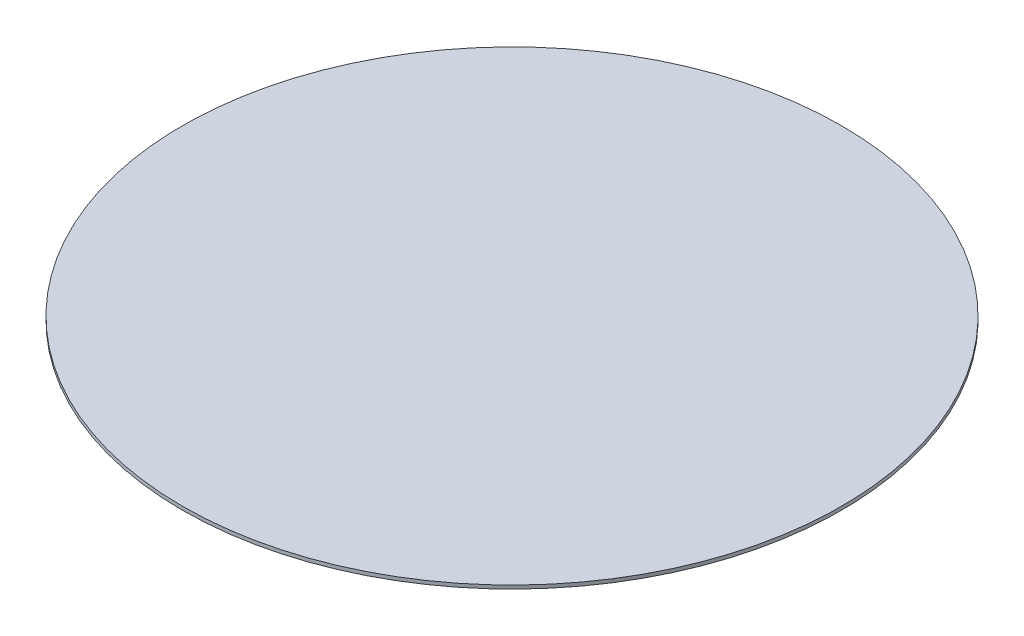
ISO-10303-21;
HEADER;
FILE_DESCRIPTION(('STEP AP214'),'2;1');
FILE_NAME('part.step','',(''),(''),'','','');
FILE_SCHEMA(('AUTOMOTIVE_DESIGN { 1 0 10303 214 1 1 1 1 }'));
ENDSEC;
DATA;
#1=APPLICATION_CONTEXT('core data for automotive mechanical design processes');
#2=APPLICATION_PROTOCOL_DEFINITION('international standard','automotive_design',2000,#1);
#3=PRODUCT_CONTEXT('',#1,'mechanical');
#4=PRODUCT('Part','Part','',(#3));
#5=PRODUCT_RELATED_PRODUCT_CATEGORY('part','',(#4));
#6=PRODUCT_DEFINITION_FORMATION('','',#4);
#7=PRODUCT_DEFINITION_CONTEXT('part definition',#1,'design');
#8=PRODUCT_DEFINITION('design','',#6,#7);
#9=PRODUCT_DEFINITION_SHAPE('','',#8);
#10=(LENGTH_UNIT() NAMED_UNIT(*) SI_UNIT(.MILLI.,.METRE.));
#11=(NAMED_UNIT(*) PLANE_ANGLE_UNIT() SI_UNIT($,.RADIAN.));
#12=(NAMED_UNIT(*) SI_UNIT($,.STERADIAN.) SOLID_ANGLE_UNIT());
#13=UNCERTAINTY_MEASURE_WITH_UNIT(LENGTH_MEASURE(1.E-05),#10,'distance_accuracy_value','');
#14=(GEOMETRIC_REPRESENTATION_CONTEXT(3) GLOBAL_UNCERTAINTY_ASSIGNED_CONTEXT((#13)) GLOBAL_UNIT_ASSIGNED_CONTEXT((#10,
#11,#12)) REPRESENTATION_CONTEXT('',''));
#15=CARTESIAN_POINT('',(0.,0.,0.));
#16=DIRECTION('',(0.,0.,1.));
#17=DIRECTION('',(1.,0.,0.));
#18=AXIS2_PLACEMENT_3D('',#15,#16,#17);
#19=CARTESIAN_POINT('',(0.,1.5875,0.));
#20=DIRECTION('',(0.,-1.,0.));
#21=DIRECTION('',(0.,0.,-1.));
#22=AXIS2_PLACEMENT_3D('',#19,#20,#21);
#23=CYLINDRICAL_SURFACE('',#22,149.225);
#24=CARTESIAN_POINT('',(0.,1.5875,0.));
#25=DIRECTION('',(0.,1.,0.));
#26=DIRECTION('',(0.,0.,1.));
#27=AXIS2_PLACEMENT_3D('',#24,#25,#26);
#28=CIRCLE('',#27,149.225);
#29=CARTESIAN_POINT('',(0.,1.5875,149.225));
#30=VERTEX_POINT('',#29);
#31=EDGE_CURVE('E10',#30,#30,#28,.T.);
#32=ORIENTED_EDGE('',*,*,#31,.F.);
#33=EDGE_LOOP('',(#32));
#34=FACE_BOUND('',#33,.T.);
#35=CARTESIAN_POINT('',(0.,0.,0.));
#36=DIRECTION('',(0.,1.,0.));
#37=DIRECTION('',(0.,0.,1.));
#38=AXIS2_PLACEMENT_3D('',#35,#36,#37);
#39=CIRCLE('',#38,149.225);
#40=CARTESIAN_POINT('',(0.,0.,149.225));
#41=VERTEX_POINT('',#40);
#42=EDGE_CURVE('E36',#41,#41,#39,.T.);
#43=ORIENTED_EDGE('',*,*,#42,.T.);
#44=EDGE_LOOP('',(#43));
#45=FACE_BOUND('',#44,.T.);
#46=ADVANCED_FACE('F33',(#34,#45),#23,.T.);
#47=CARTESIAN_POINT('',(0.,1.5875,0.));
#48=DIRECTION('',(0.,1.,0.));
#49=DIRECTION('',(0.,0.,1.));
#50=AXIS2_PLACEMENT_3D('',#47,#48,#49);
#51=PLANE('',#50);
#52=ORIENTED_EDGE('',*,*,#31,.T.);
#53=EDGE_LOOP('',(#52));
#54=FACE_BOUND('',#53,.T.);
#55=ADVANCED_FACE('F48',(#54),#51,.T.);
#56=CARTESIAN_POINT('',(0.,0.,0.));
#57=DIRECTION('',(0.,1.,0.));
#58=DIRECTION('',(0.,0.,1.));
#59=AXIS2_PLACEMENT_3D('',#56,#57,#58);
#60=PLANE('',#59);
#61=ORIENTED_EDGE('',*,*,#42,.F.);
#62=EDGE_LOOP('',(#61));
#63=FACE_BOUND('',#62,.T.);
#64=ADVANCED_FACE('F46',(#63),#60,.F.);
#65=CLOSED_SHELL('',(#46,#55,#64));
#66=MANIFOLD_SOLID_BREP('B2',#65);
#67=ADVANCED_BREP_SHAPE_REPRESENTATION('',(#18,#66),#14);
#68=SHAPE_DEFINITION_REPRESENTATION(#9,#67);
ENDSEC;
END-ISO-10303-21;
